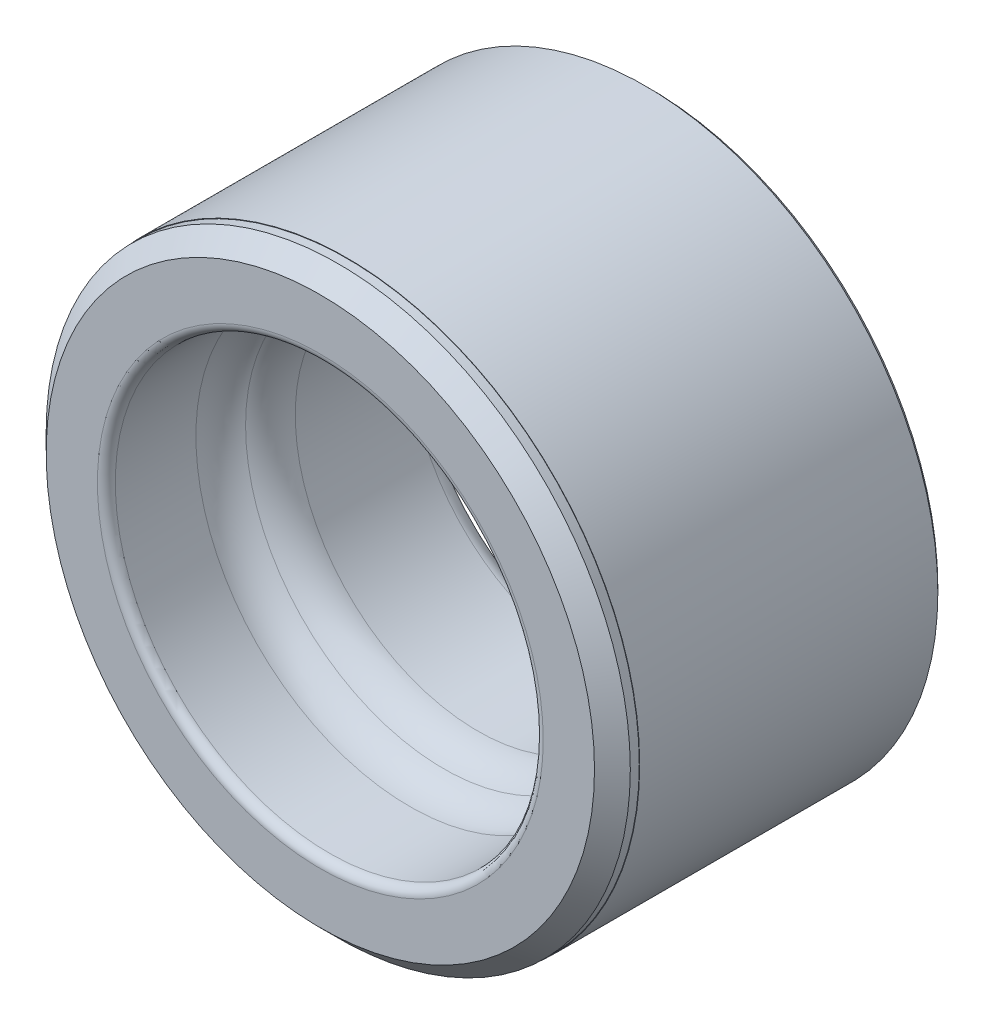
ISO-10303-21;
HEADER;
FILE_DESCRIPTION(('STEP AP214'),'2;1');
FILE_NAME('part.step','',(''),(''),'','','');
FILE_SCHEMA(('AUTOMOTIVE_DESIGN { 1 0 10303 214 1 1 1 1 }'));
ENDSEC;
DATA;
#1=APPLICATION_CONTEXT('core data for automotive mechanical design processes');
#2=APPLICATION_PROTOCOL_DEFINITION('international standard','automotive_design',2000,#1);
#3=PRODUCT_CONTEXT('',#1,'mechanical');
#4=PRODUCT('Part','Part','',(#3));
#5=PRODUCT_RELATED_PRODUCT_CATEGORY('part','',(#4));
#6=PRODUCT_DEFINITION_FORMATION('','',#4);
#7=PRODUCT_DEFINITION_CONTEXT('part definition',#1,'design');
#8=PRODUCT_DEFINITION('design','',#6,#7);
#9=PRODUCT_DEFINITION_SHAPE('','',#8);
#10=(LENGTH_UNIT() NAMED_UNIT(*) SI_UNIT(.MILLI.,.METRE.));
#11=(NAMED_UNIT(*) PLANE_ANGLE_UNIT() SI_UNIT($,.RADIAN.));
#12=(NAMED_UNIT(*) SI_UNIT($,.STERADIAN.) SOLID_ANGLE_UNIT());
#13=UNCERTAINTY_MEASURE_WITH_UNIT(LENGTH_MEASURE(1.E-05),#10,'distance_accuracy_value','');
#14=(GEOMETRIC_REPRESENTATION_CONTEXT(3) GLOBAL_UNCERTAINTY_ASSIGNED_CONTEXT((#13)) GLOBAL_UNIT_ASSIGNED_CONTEXT((#10,
#11,#12)) REPRESENTATION_CONTEXT('',''));
#15=CARTESIAN_POINT('',(0.,0.,0.));
#16=DIRECTION('',(0.,0.,1.));
#17=DIRECTION('',(1.,0.,0.));
#18=AXIS2_PLACEMENT_3D('',#15,#16,#17);
#19=CARTESIAN_POINT('',(0.,32.625,-3.));
#20=DIRECTION('',(0.,0.,-1.));
#21=DIRECTION('',(-1.,0.,0.));
#22=AXIS2_PLACEMENT_3D('',#19,#20,#21);
#23=PLANE('',#22);
#24=CARTESIAN_POINT('',(0.,0.,-3.));
#25=DIRECTION('',(0.,0.,1.));
#26=DIRECTION('',(1.,0.,0.));
#27=AXIS2_PLACEMENT_3D('',#24,#25,#26);
#28=CIRCLE('',#27,32.625);
#29=CARTESIAN_POINT('',(32.625,0.,-3.));
#30=VERTEX_POINT('',#29);
#31=EDGE_CURVE('E10',#30,#30,#28,.T.);
#32=ORIENTED_EDGE('',*,*,#31,.F.);
#33=EDGE_LOOP('',(#32));
#34=FACE_BOUND('',#33,.T.);
#35=CARTESIAN_POINT('',(0.,0.,-3.));
#36=DIRECTION('',(0.,0.,1.));
#37=DIRECTION('',(1.,0.,0.));
#38=AXIS2_PLACEMENT_3D('',#35,#36,#37);
#39=CIRCLE('',#38,32.675);
#40=CARTESIAN_POINT('',(32.675,0.,-3.));
#41=VERTEX_POINT('',#40);
#42=EDGE_CURVE('E98',#41,#41,#39,.T.);
#43=ORIENTED_EDGE('',*,*,#42,.T.);
#44=EDGE_LOOP('',(#43));
#45=FACE_BOUND('',#44,.T.);
#46=ADVANCED_FACE('F37',(#34,#45),#23,.F.);
#47=CARTESIAN_POINT('',(0.,0.,0.));
#48=DIRECTION('',(0.,0.,1.));
#49=DIRECTION('',(1.,0.,0.));
#50=AXIS2_PLACEMENT_3D('',#47,#48,#49);
#51=CYLINDRICAL_SURFACE('',#50,32.625);
#52=CARTESIAN_POINT('',(0.,0.,-2.));
#53=DIRECTION('',(0.,0.,1.));
#54=DIRECTION('',(1.,0.,0.));
#55=AXIS2_PLACEMENT_3D('',#52,#53,#54);
#56=CIRCLE('',#55,32.625);
#57=CARTESIAN_POINT('',(32.625,0.,-2.));
#58=VERTEX_POINT('',#57);
#59=EDGE_CURVE('E44',#58,#58,#56,.T.);
#60=ORIENTED_EDGE('',*,*,#59,.F.);
#61=EDGE_LOOP('',(#60));
#62=FACE_BOUND('',#61,.T.);
#63=ORIENTED_EDGE('',*,*,#31,.T.);
#64=EDGE_LOOP('',(#63));
#65=FACE_BOUND('',#64,.T.);
#66=ADVANCED_FACE('F173',(#62,#65),#51,.T.);
#67=CARTESIAN_POINT('',(0.,0.,-2.));
#68=DIRECTION('',(0.,0.,-1.));
#69=DIRECTION('',(-1.,0.,0.));
#70=AXIS2_PLACEMENT_3D('',#67,#68,#69);
#71=CONICAL_SURFACE('',#70,32.625,0.785398163397447);
#72=CARTESIAN_POINT('',(0.,0.,0.));
#73=DIRECTION('',(0.,0.,1.));
#74=DIRECTION('',(1.,0.,0.));
#75=AXIS2_PLACEMENT_3D('',#72,#73,#74);
#76=CIRCLE('',#75,30.625);
#77=CARTESIAN_POINT('',(30.625,0.,0.));
#78=VERTEX_POINT('',#77);
#79=EDGE_CURVE('E50',#78,#78,#76,.T.);
#80=ORIENTED_EDGE('',*,*,#79,.F.);
#81=EDGE_LOOP('',(#80));
#82=FACE_BOUND('',#81,.T.);
#83=ORIENTED_EDGE('',*,*,#59,.T.);
#84=EDGE_LOOP('',(#83));
#85=FACE_BOUND('',#84,.T.);
#86=ADVANCED_FACE('F168',(#82,#85),#71,.T.);
#87=CARTESIAN_POINT('',(0.,24.9,0.));
#88=DIRECTION('',(0.,0.,-1.));
#89=DIRECTION('',(-1.,0.,0.));
#90=AXIS2_PLACEMENT_3D('',#87,#88,#89);
#91=PLANE('',#90);
#92=CARTESIAN_POINT('',(0.,0.,0.));
#93=DIRECTION('',(0.,0.,1.));
#94=DIRECTION('',(1.,0.,0.));
#95=AXIS2_PLACEMENT_3D('',#92,#93,#94);
#96=CIRCLE('',#95,24.9);
#97=CARTESIAN_POINT('',(24.9,0.,0.));
#98=VERTEX_POINT('',#97);
#99=EDGE_CURVE('E56',#98,#98,#96,.T.);
#100=ORIENTED_EDGE('',*,*,#99,.F.);
#101=EDGE_LOOP('',(#100));
#102=FACE_BOUND('',#101,.T.);
#103=ORIENTED_EDGE('',*,*,#79,.T.);
#104=EDGE_LOOP('',(#103));
#105=FACE_BOUND('',#104,.T.);
#106=ADVANCED_FACE('F162',(#102,#105),#91,.F.);
#107=CARTESIAN_POINT('',(0.,0.,-1.));
#108=DIRECTION('',(0.,0.,1.));
#109=DIRECTION('',(1.,0.,0.));
#110=AXIS2_PLACEMENT_3D('',#107,#108,#109);
#111=TOROIDAL_SURFACE('',#110,24.9,1.);
#112=CARTESIAN_POINT('',(0.,0.,-1.));
#113=DIRECTION('',(0.,0.,1.));
#114=DIRECTION('',(1.,0.,0.));
#115=AXIS2_PLACEMENT_3D('',#112,#113,#114);
#116=CIRCLE('',#115,23.9);
#117=CARTESIAN_POINT('',(23.9,0.,-1.));
#118=VERTEX_POINT('',#117);
#119=EDGE_CURVE('E62',#118,#118,#116,.T.);
#120=ORIENTED_EDGE('',*,*,#119,.F.);
#121=EDGE_LOOP('',(#120));
#122=FACE_BOUND('',#121,.T.);
#123=ORIENTED_EDGE('',*,*,#99,.T.);
#124=EDGE_LOOP('',(#123));
#125=FACE_BOUND('',#124,.T.);
#126=ADVANCED_FACE('F156',(#122,#125),#111,.T.);
#127=CARTESIAN_POINT('',(0.,0.,0.));
#128=DIRECTION('',(0.,0.,1.));
#129=DIRECTION('',(1.,0.,0.));
#130=AXIS2_PLACEMENT_3D('',#127,#128,#129);
#131=CYLINDRICAL_SURFACE('',#130,23.9);
#132=CARTESIAN_POINT('',(0.,0.,-10.));
#133=DIRECTION('',(0.,0.,1.));
#134=DIRECTION('',(1.,0.,0.));
#135=AXIS2_PLACEMENT_3D('',#132,#133,#134);
#136=CIRCLE('',#135,23.9);
#137=CARTESIAN_POINT('',(23.9,0.,-10.));
#138=VERTEX_POINT('',#137);
#139=EDGE_CURVE('E66',#138,#138,#136,.T.);
#140=ORIENTED_EDGE('',*,*,#139,.F.);
#141=EDGE_LOOP('',(#140));
#142=FACE_BOUND('',#141,.T.);
#143=ORIENTED_EDGE('',*,*,#119,.T.);
#144=EDGE_LOOP('',(#143));
#145=FACE_BOUND('',#144,.T.);
#146=ADVANCED_FACE('F150',(#142,#145),#131,.F.);
#147=CARTESIAN_POINT('',(0.,0.,-10.));
#148=DIRECTION('',(0.,0.,1.));
#149=DIRECTION('',(1.,0.,0.));
#150=AXIS2_PLACEMENT_3D('',#147,#148,#149);
#151=TOROIDAL_SURFACE('',#150,18.9,5.);
#152=CARTESIAN_POINT('',(0.,0.,-13.7996710383927));
#153=DIRECTION('',(0.,0.,1.));
#154=DIRECTION('',(1.,0.,0.));
#155=AXIS2_PLACEMENT_3D('',#152,#153,#154);
#156=CIRCLE('',#155,22.15);
#157=CARTESIAN_POINT('',(22.15,0.,-13.7996710383927));
#158=VERTEX_POINT('',#157);
#159=EDGE_CURVE('E70',#158,#158,#156,.T.);
#160=ORIENTED_EDGE('',*,*,#159,.F.);
#161=EDGE_LOOP('',(#160));
#162=FACE_BOUND('',#161,.T.);
#163=ORIENTED_EDGE('',*,*,#139,.T.);
#164=EDGE_LOOP('',(#163));
#165=FACE_BOUND('',#164,.T.);
#166=ADVANCED_FACE('F144',(#162,#165),#151,.F.);
#167=CARTESIAN_POINT('',(0.,0.,-17.5993420767853));
#168=DIRECTION('',(0.,0.,1.));
#169=DIRECTION('',(1.,0.,0.));
#170=AXIS2_PLACEMENT_3D('',#167,#168,#169);
#171=TOROIDAL_SURFACE('',#170,25.4,5.);
#172=CARTESIAN_POINT('',(0.,0.,-17.5993420767853));
#173=DIRECTION('',(0.,0.,1.));
#174=DIRECTION('',(1.,0.,0.));
#175=AXIS2_PLACEMENT_3D('',#172,#173,#174);
#176=CIRCLE('',#175,20.4);
#177=CARTESIAN_POINT('',(20.4,0.,-17.5993420767853));
#178=VERTEX_POINT('',#177);
#179=EDGE_CURVE('E74',#178,#178,#176,.T.);
#180=ORIENTED_EDGE('',*,*,#179,.F.);
#181=EDGE_LOOP('',(#180));
#182=FACE_BOUND('',#181,.T.);
#183=ORIENTED_EDGE('',*,*,#159,.T.);
#184=EDGE_LOOP('',(#183));
#185=FACE_BOUND('',#184,.T.);
#186=ADVANCED_FACE('F138',(#182,#185),#171,.T.);
#187=CARTESIAN_POINT('',(0.,0.,0.));
#188=DIRECTION('',(0.,0.,1.));
#189=DIRECTION('',(1.,0.,0.));
#190=AXIS2_PLACEMENT_3D('',#187,#188,#189);
#191=CYLINDRICAL_SURFACE('',#190,20.4);
#192=CARTESIAN_POINT('',(0.,0.,-30.3914120119951));
#193=DIRECTION('',(0.,0.,1.));
#194=DIRECTION('',(1.,0.,0.));
#195=AXIS2_PLACEMENT_3D('',#192,#193,#194);
#196=CIRCLE('',#195,20.4);
#197=CARTESIAN_POINT('',(20.4,0.,-30.3914120119951));
#198=VERTEX_POINT('',#197);
#199=EDGE_CURVE('E78',#198,#198,#196,.T.);
#200=ORIENTED_EDGE('',*,*,#199,.F.);
#201=EDGE_LOOP('',(#200));
#202=FACE_BOUND('',#201,.T.);
#203=ORIENTED_EDGE('',*,*,#179,.T.);
#204=EDGE_LOOP('',(#203));
#205=FACE_BOUND('',#204,.T.);
#206=ADVANCED_FACE('F132',(#202,#205),#191,.F.);
#207=CARTESIAN_POINT('',(0.,0.,-30.3914120119951));
#208=DIRECTION('',(0.,0.,1.));
#209=DIRECTION('',(1.,0.,0.));
#210=AXIS2_PLACEMENT_3D('',#207,#208,#209);
#211=TOROIDAL_SURFACE('',#210,22.4,2.);
#212=CARTESIAN_POINT('',(0.,0.,-32.123462819564));
#213=DIRECTION('',(0.,0.,1.));
#214=DIRECTION('',(1.,0.,0.));
#215=AXIS2_PLACEMENT_3D('',#212,#213,#214);
#216=CIRCLE('',#215,21.4);
#217=CARTESIAN_POINT('',(21.4,0.,-32.123462819564));
#218=VERTEX_POINT('',#217);
#219=EDGE_CURVE('E82',#218,#218,#216,.T.);
#220=ORIENTED_EDGE('',*,*,#219,.F.);
#221=EDGE_LOOP('',(#220));
#222=FACE_BOUND('',#221,.T.);
#223=ORIENTED_EDGE('',*,*,#199,.T.);
#224=EDGE_LOOP('',(#223));
#225=FACE_BOUND('',#224,.T.);
#226=ADVANCED_FACE('F126',(#222,#225),#211,.T.);
#227=CARTESIAN_POINT('',(0.,0.,-32.123462819564));
#228=DIRECTION('',(0.,0.,-1.));
#229=DIRECTION('',(-1.,0.,0.));
#230=AXIS2_PLACEMENT_3D('',#227,#228,#229);
#231=CONICAL_SURFACE('',#230,21.4,1.04719755119659);
#232=CARTESIAN_POINT('',(0.,0.,-36.8));
#233=DIRECTION('',(0.,0.,1.));
#234=DIRECTION('',(1.,0.,0.));
#235=AXIS2_PLACEMENT_3D('',#232,#233,#234);
#236=CIRCLE('',#235,29.5);
#237=CARTESIAN_POINT('',(29.5,0.,-36.8));
#238=VERTEX_POINT('',#237);
#239=EDGE_CURVE('E86',#238,#238,#236,.T.);
#240=ORIENTED_EDGE('',*,*,#239,.F.);
#241=EDGE_LOOP('',(#240));
#242=FACE_BOUND('',#241,.T.);
#243=ORIENTED_EDGE('',*,*,#219,.T.);
#244=EDGE_LOOP('',(#243));
#245=FACE_BOUND('',#244,.T.);
#246=ADVANCED_FACE('F120',(#242,#245),#231,.F.);
#247=CARTESIAN_POINT('',(0.,29.5,-36.8));
#248=DIRECTION('',(0.,0.,1.));
#249=DIRECTION('',(1.,0.,0.));
#250=AXIS2_PLACEMENT_3D('',#247,#248,#249);
#251=PLANE('',#250);
#252=CARTESIAN_POINT('',(0.,0.,-36.8));
#253=DIRECTION('',(0.,0.,1.));
#254=DIRECTION('',(1.,0.,0.));
#255=AXIS2_PLACEMENT_3D('',#252,#253,#254);
#256=CIRCLE('',#255,32.175);
#257=CARTESIAN_POINT('',(32.175,0.,-36.8));
#258=VERTEX_POINT('',#257);
#259=EDGE_CURVE('E90',#258,#258,#256,.T.);
#260=ORIENTED_EDGE('',*,*,#259,.F.);
#261=EDGE_LOOP('',(#260));
#262=FACE_BOUND('',#261,.T.);
#263=ORIENTED_EDGE('',*,*,#239,.T.);
#264=EDGE_LOOP('',(#263));
#265=FACE_BOUND('',#264,.T.);
#266=ADVANCED_FACE('F114',(#262,#265),#251,.F.);
#267=CARTESIAN_POINT('',(0.,0.,-36.8));
#268=DIRECTION('',(0.,0.,1.));
#269=DIRECTION('',(1.,0.,0.));
#270=AXIS2_PLACEMENT_3D('',#267,#268,#269);
#271=CONICAL_SURFACE('',#270,32.175,0.785398163397448);
#272=CARTESIAN_POINT('',(0.,0.,-36.3));
#273=DIRECTION('',(0.,0.,1.));
#274=DIRECTION('',(1.,0.,0.));
#275=AXIS2_PLACEMENT_3D('',#272,#273,#274);
#276=CIRCLE('',#275,32.675);
#277=CARTESIAN_POINT('',(32.675,0.,-36.3));
#278=VERTEX_POINT('',#277);
#279=EDGE_CURVE('E94',#278,#278,#276,.T.);
#280=ORIENTED_EDGE('',*,*,#279,.F.);
#281=EDGE_LOOP('',(#280));
#282=FACE_BOUND('',#281,.T.);
#283=ORIENTED_EDGE('',*,*,#259,.T.);
#284=EDGE_LOOP('',(#283));
#285=FACE_BOUND('',#284,.T.);
#286=ADVANCED_FACE('F108',(#282,#285),#271,.T.);
#287=CARTESIAN_POINT('',(0.,0.,0.));
#288=DIRECTION('',(0.,0.,1.));
#289=DIRECTION('',(1.,0.,0.));
#290=AXIS2_PLACEMENT_3D('',#287,#288,#289);
#291=CYLINDRICAL_SURFACE('',#290,32.675);
#292=ORIENTED_EDGE('',*,*,#42,.F.);
#293=EDGE_LOOP('',(#292));
#294=FACE_BOUND('',#293,.T.);
#295=ORIENTED_EDGE('',*,*,#279,.T.);
#296=EDGE_LOOP('',(#295));
#297=FACE_BOUND('',#296,.T.);
#298=ADVANCED_FACE('F105',(#294,#297),#291,.T.);
#299=CLOSED_SHELL('',(#46,#66,#86,#106,#126,#146,#166,#186,#206,#226,#246,#266,#286,#298));
#300=MANIFOLD_SOLID_BREP('B2',#299);
#301=ADVANCED_BREP_SHAPE_REPRESENTATION('',(#18,#300),#14);
#302=SHAPE_DEFINITION_REPRESENTATION(#9,#301);
ENDSEC;
END-ISO-10303-21;
